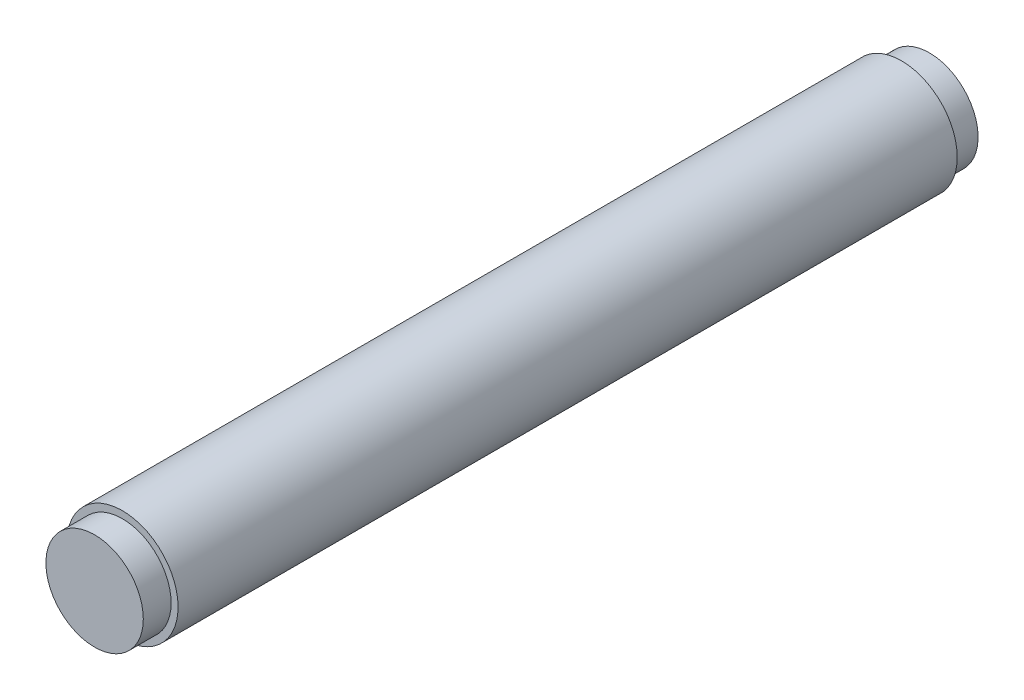
ISO-10303-21;
HEADER;
FILE_DESCRIPTION(('STEP AP214'),'2;1');
FILE_NAME('part.step','',(''),(''),'','','');
FILE_SCHEMA(('AUTOMOTIVE_DESIGN { 1 0 10303 214 1 1 1 1 }'));
ENDSEC;
DATA;
#1=APPLICATION_CONTEXT('core data for automotive mechanical design processes');
#2=APPLICATION_PROTOCOL_DEFINITION('international standard','automotive_design',2000,#1);
#3=PRODUCT_CONTEXT('',#1,'mechanical');
#4=PRODUCT('Part','Part','',(#3));
#5=PRODUCT_RELATED_PRODUCT_CATEGORY('part','',(#4));
#6=PRODUCT_DEFINITION_FORMATION('','',#4);
#7=PRODUCT_DEFINITION_CONTEXT('part definition',#1,'design');
#8=PRODUCT_DEFINITION('design','',#6,#7);
#9=PRODUCT_DEFINITION_SHAPE('','',#8);
#10=(LENGTH_UNIT() NAMED_UNIT(*) SI_UNIT(.MILLI.,.METRE.));
#11=(NAMED_UNIT(*) PLANE_ANGLE_UNIT() SI_UNIT($,.RADIAN.));
#12=(NAMED_UNIT(*) SI_UNIT($,.STERADIAN.) SOLID_ANGLE_UNIT());
#13=UNCERTAINTY_MEASURE_WITH_UNIT(LENGTH_MEASURE(1.E-05),#10,'distance_accuracy_value','');
#14=(GEOMETRIC_REPRESENTATION_CONTEXT(3) GLOBAL_UNCERTAINTY_ASSIGNED_CONTEXT((#13)) GLOBAL_UNIT_ASSIGNED_CONTEXT((#10,
#11,#12)) REPRESENTATION_CONTEXT('',''));
#15=CARTESIAN_POINT('',(0.,0.,0.));
#16=DIRECTION('',(0.,0.,1.));
#17=DIRECTION('',(1.,0.,0.));
#18=AXIS2_PLACEMENT_3D('',#15,#16,#17);
#19=CARTESIAN_POINT('',(0.,0.,-190.5));
#20=DIRECTION('',(0.,0.,1.));
#21=DIRECTION('',(1.,0.,0.));
#22=AXIS2_PLACEMENT_3D('',#19,#20,#21);
#23=CYLINDRICAL_SURFACE('',#22,25.4);
#24=CARTESIAN_POINT('',(0.,0.,177.8));
#25=DIRECTION('',(0.,0.,1.));
#26=DIRECTION('',(1.,0.,0.));
#27=AXIS2_PLACEMENT_3D('',#24,#25,#26);
#28=CIRCLE('',#27,25.4);
#29=CARTESIAN_POINT('',(25.4,0.,177.8));
#30=VERTEX_POINT('',#29);
#31=EDGE_CURVE('E10',#30,#30,#28,.T.);
#32=ORIENTED_EDGE('',*,*,#31,.F.);
#33=EDGE_LOOP('',(#32));
#34=FACE_BOUND('',#33,.T.);
#35=CARTESIAN_POINT('',(0.,0.,-177.8));
#36=DIRECTION('',(0.,0.,-1.));
#37=DIRECTION('',(-1.,0.,0.));
#38=AXIS2_PLACEMENT_3D('',#35,#36,#37);
#39=CIRCLE('',#38,25.4);
#40=CARTESIAN_POINT('',(-25.4,0.,-177.8));
#41=VERTEX_POINT('',#40);
#42=EDGE_CURVE('E54',#41,#41,#39,.T.);
#43=ORIENTED_EDGE('',*,*,#42,.F.);
#44=EDGE_LOOP('',(#43));
#45=FACE_BOUND('',#44,.T.);
#46=ADVANCED_FACE('F36',(#34,#45),#23,.T.);
#47=CARTESIAN_POINT('',(0.,0.,177.8));
#48=DIRECTION('',(0.,0.,1.));
#49=DIRECTION('',(1.,0.,0.));
#50=AXIS2_PLACEMENT_3D('',#47,#48,#49);
#51=PLANE('',#50);
#52=CARTESIAN_POINT('',(0.,0.,177.8));
#53=DIRECTION('',(0.,0.,1.));
#54=DIRECTION('',(1.,0.,0.));
#55=AXIS2_PLACEMENT_3D('',#52,#53,#54);
#56=CIRCLE('',#55,22.225);
#57=CARTESIAN_POINT('',(22.225,0.,177.8));
#58=VERTEX_POINT('',#57);
#59=EDGE_CURVE('E43',#58,#58,#56,.T.);
#60=ORIENTED_EDGE('',*,*,#59,.F.);
#61=EDGE_LOOP('',(#60));
#62=FACE_BOUND('',#61,.T.);
#63=ORIENTED_EDGE('',*,*,#31,.T.);
#64=EDGE_LOOP('',(#63));
#65=FACE_BOUND('',#64,.T.);
#66=ADVANCED_FACE('F79',(#62,#65),#51,.T.);
#67=CARTESIAN_POINT('',(0.,0.,177.8));
#68=DIRECTION('',(0.,0.,1.));
#69=DIRECTION('',(1.,0.,0.));
#70=AXIS2_PLACEMENT_3D('',#67,#68,#69);
#71=CYLINDRICAL_SURFACE('',#70,22.225);
#72=ORIENTED_EDGE('',*,*,#59,.T.);
#73=EDGE_LOOP('',(#72));
#74=FACE_BOUND('',#73,.T.);
#75=CARTESIAN_POINT('',(0.,0.,190.5));
#76=DIRECTION('',(0.,0.,1.));
#77=DIRECTION('',(1.,0.,0.));
#78=AXIS2_PLACEMENT_3D('',#75,#76,#77);
#79=CIRCLE('',#78,22.225);
#80=CARTESIAN_POINT('',(22.225,0.,190.5));
#81=VERTEX_POINT('',#80);
#82=EDGE_CURVE('E48',#81,#81,#79,.T.);
#83=ORIENTED_EDGE('',*,*,#82,.F.);
#84=EDGE_LOOP('',(#83));
#85=FACE_BOUND('',#84,.T.);
#86=ADVANCED_FACE('F86',(#74,#85),#71,.T.);
#87=CARTESIAN_POINT('',(0.,0.,190.5));
#88=DIRECTION('',(0.,0.,1.));
#89=DIRECTION('',(1.,0.,0.));
#90=AXIS2_PLACEMENT_3D('',#87,#88,#89);
#91=PLANE('',#90);
#92=ORIENTED_EDGE('',*,*,#82,.T.);
#93=EDGE_LOOP('',(#92));
#94=FACE_BOUND('',#93,.T.);
#95=ADVANCED_FACE('F74',(#94),#91,.T.);
#96=CARTESIAN_POINT('',(0.,0.,-177.8));
#97=DIRECTION('',(0.,0.,-1.));
#98=DIRECTION('',(-1.,0.,0.));
#99=AXIS2_PLACEMENT_3D('',#96,#97,#98);
#100=PLANE('',#99);
#101=CARTESIAN_POINT('',(0.,0.,-177.8));
#102=DIRECTION('',(0.,0.,-1.));
#103=DIRECTION('',(-1.,0.,0.));
#104=AXIS2_PLACEMENT_3D('',#101,#102,#103);
#105=CIRCLE('',#104,22.225);
#106=CARTESIAN_POINT('',(-22.225,0.,-177.8));
#107=VERTEX_POINT('',#106);
#108=EDGE_CURVE('E59',#107,#107,#105,.T.);
#109=ORIENTED_EDGE('',*,*,#108,.F.);
#110=EDGE_LOOP('',(#109));
#111=FACE_BOUND('',#110,.T.);
#112=ORIENTED_EDGE('',*,*,#42,.T.);
#113=EDGE_LOOP('',(#112));
#114=FACE_BOUND('',#113,.T.);
#115=ADVANCED_FACE('F71',(#111,#114),#100,.T.);
#116=CARTESIAN_POINT('',(0.,0.,-177.8));
#117=DIRECTION('',(0.,0.,-1.));
#118=DIRECTION('',(-1.,0.,0.));
#119=AXIS2_PLACEMENT_3D('',#116,#117,#118);
#120=CYLINDRICAL_SURFACE('',#119,22.225);
#121=ORIENTED_EDGE('',*,*,#108,.T.);
#122=EDGE_LOOP('',(#121));
#123=FACE_BOUND('',#122,.T.);
#124=CARTESIAN_POINT('',(0.,0.,-190.5));
#125=DIRECTION('',(0.,0.,-1.));
#126=DIRECTION('',(-1.,0.,0.));
#127=AXIS2_PLACEMENT_3D('',#124,#125,#126);
#128=CIRCLE('',#127,22.225);
#129=CARTESIAN_POINT('',(-22.225,0.,-190.5));
#130=VERTEX_POINT('',#129);
#131=EDGE_CURVE('E60',#130,#130,#128,.T.);
#132=ORIENTED_EDGE('',*,*,#131,.F.);
#133=EDGE_LOOP('',(#132));
#134=FACE_BOUND('',#133,.T.);
#135=ADVANCED_FACE('F68',(#123,#134),#120,.T.);
#136=CARTESIAN_POINT('',(0.,0.,-190.5));
#137=DIRECTION('',(0.,0.,1.));
#138=DIRECTION('',(1.,0.,0.));
#139=AXIS2_PLACEMENT_3D('',#136,#137,#138);
#140=PLANE('',#139);
#141=ORIENTED_EDGE('',*,*,#131,.T.);
#142=EDGE_LOOP('',(#141));
#143=FACE_BOUND('',#142,.T.);
#144=ADVANCED_FACE('F94',(#143),#140,.F.);
#145=CLOSED_SHELL('',(#46,#66,#86,#95,#115,#135,#144));
#146=MANIFOLD_SOLID_BREP('B2',#145);
#147=ADVANCED_BREP_SHAPE_REPRESENTATION('',(#18,#146),#14);
#148=SHAPE_DEFINITION_REPRESENTATION(#9,#147);
ENDSEC;
END-ISO-10303-21;
